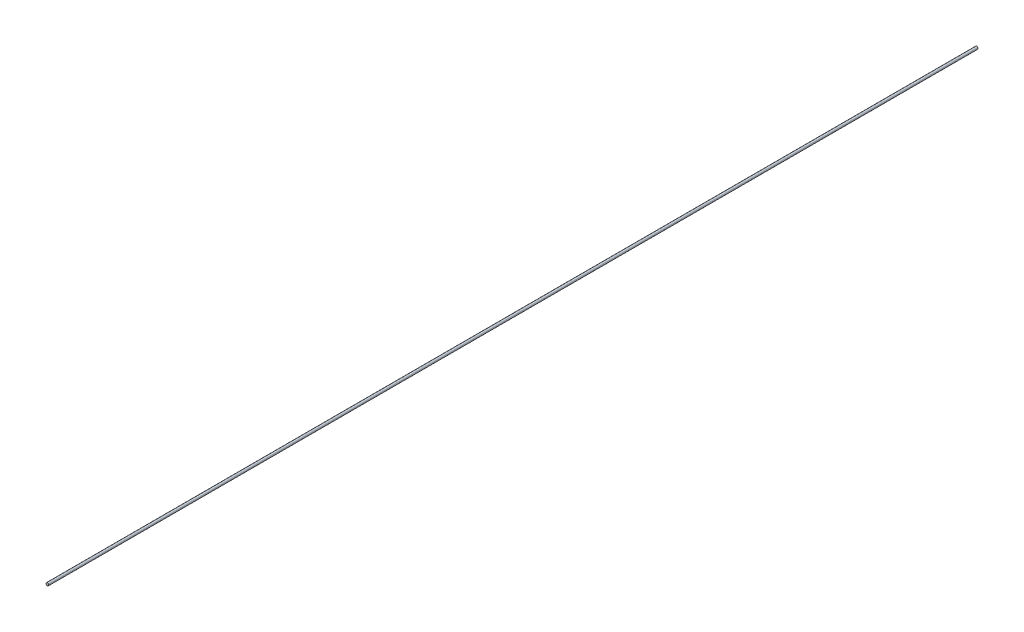
ISO-10303-21;
HEADER;
FILE_DESCRIPTION(('STEP AP214'),'2;1');
FILE_NAME('part.step','',(''),(''),'','','');
FILE_SCHEMA(('AUTOMOTIVE_DESIGN { 1 0 10303 214 1 1 1 1 }'));
ENDSEC;
DATA;
#1=APPLICATION_CONTEXT('core data for automotive mechanical design processes');
#2=APPLICATION_PROTOCOL_DEFINITION('international standard','automotive_design',2000,#1);
#3=PRODUCT_CONTEXT('',#1,'mechanical');
#4=PRODUCT('Part','Part','',(#3));
#5=PRODUCT_RELATED_PRODUCT_CATEGORY('part','',(#4));
#6=PRODUCT_DEFINITION_FORMATION('','',#4);
#7=PRODUCT_DEFINITION_CONTEXT('part definition',#1,'design');
#8=PRODUCT_DEFINITION('design','',#6,#7);
#9=PRODUCT_DEFINITION_SHAPE('','',#8);
#10=(LENGTH_UNIT() NAMED_UNIT(*) SI_UNIT(.MILLI.,.METRE.));
#11=(NAMED_UNIT(*) PLANE_ANGLE_UNIT() SI_UNIT($,.RADIAN.));
#12=(NAMED_UNIT(*) SI_UNIT($,.STERADIAN.) SOLID_ANGLE_UNIT());
#13=UNCERTAINTY_MEASURE_WITH_UNIT(LENGTH_MEASURE(1.E-05),#10,'distance_accuracy_value','');
#14=(GEOMETRIC_REPRESENTATION_CONTEXT(3) GLOBAL_UNCERTAINTY_ASSIGNED_CONTEXT((#13)) GLOBAL_UNIT_ASSIGNED_CONTEXT((#10,
#11,#12)) REPRESENTATION_CONTEXT('',''));
#15=CARTESIAN_POINT('',(0.,0.,0.));
#16=DIRECTION('',(0.,0.,1.));
#17=DIRECTION('',(1.,0.,0.));
#18=AXIS2_PLACEMENT_3D('',#15,#16,#17);
#19=CARTESIAN_POINT('',(-3.01379167716479,0.,-802.44390303183));
#20=DIRECTION('',(0.,0.,-1.));
#21=DIRECTION('',(-1.,0.,0.));
#22=AXIS2_PLACEMENT_3D('',#19,#20,#21);
#23=CYLINDRICAL_SURFACE('',#22,1.27);
#24=CARTESIAN_POINT('',(-3.0137916771647,0.,86.55609696817));
#25=DIRECTION('',(0.,0.,-1.));
#26=DIRECTION('',(-1.,0.,0.));
#27=AXIS2_PLACEMENT_3D('',#24,#25,#26);
#28=CIRCLE('',#27,1.27);
#29=CARTESIAN_POINT('',(-4.2837916771647,0.,86.55609696817));
#30=VERTEX_POINT('',#29);
#31=EDGE_CURVE('E49',#30,#30,#28,.T.);
#32=ORIENTED_EDGE('',*,*,#31,.T.);
#33=EDGE_LOOP('',(#32));
#34=FACE_BOUND('',#33,.T.);
#35=CARTESIAN_POINT('',(-3.01379167716479,0.,-802.44390303183));
#36=DIRECTION('',(0.,0.,-1.));
#37=DIRECTION('',(-1.,0.,0.));
#38=AXIS2_PLACEMENT_3D('',#35,#36,#37);
#39=CIRCLE('',#38,1.27);
#40=CARTESIAN_POINT('',(-4.28379167716479,0.,-802.44390303183));
#41=VERTEX_POINT('',#40);
#42=EDGE_CURVE('E10',#41,#41,#39,.T.);
#43=ORIENTED_EDGE('',*,*,#42,.F.);
#44=EDGE_LOOP('',(#43));
#45=FACE_BOUND('',#44,.T.);
#46=ADVANCED_FACE('F43',(#34,#45),#23,.T.);
#47=CARTESIAN_POINT('',(-4.28379167716479,0.,-802.44390303183));
#48=DIRECTION('',(0.,0.,1.));
#49=DIRECTION('',(1.,0.,0.));
#50=AXIS2_PLACEMENT_3D('',#47,#48,#49);
#51=PLANE('',#50);
#52=ORIENTED_EDGE('',*,*,#42,.T.);
#53=EDGE_LOOP('',(#52));
#54=FACE_BOUND('',#53,.T.);
#55=ADVANCED_FACE('F59',(#54),#51,.F.);
#56=CARTESIAN_POINT('',(-3.0137916771647,0.,86.55609696817));
#57=DIRECTION('',(0.,0.,-1.));
#58=DIRECTION('',(-1.,0.,0.));
#59=AXIS2_PLACEMENT_3D('',#56,#57,#58);
#60=PLANE('',#59);
#61=ORIENTED_EDGE('',*,*,#31,.F.);
#62=EDGE_LOOP('',(#61));
#63=FACE_BOUND('',#62,.T.);
#64=ADVANCED_FACE('F57',(#63),#60,.F.);
#65=CLOSED_SHELL('',(#46,#55,#64));
#66=MANIFOLD_SOLID_BREP('B2',#65);
#67=ADVANCED_BREP_SHAPE_REPRESENTATION('',(#18,#66),#14);
#68=SHAPE_DEFINITION_REPRESENTATION(#9,#67);
ENDSEC;
END-ISO-10303-21;
